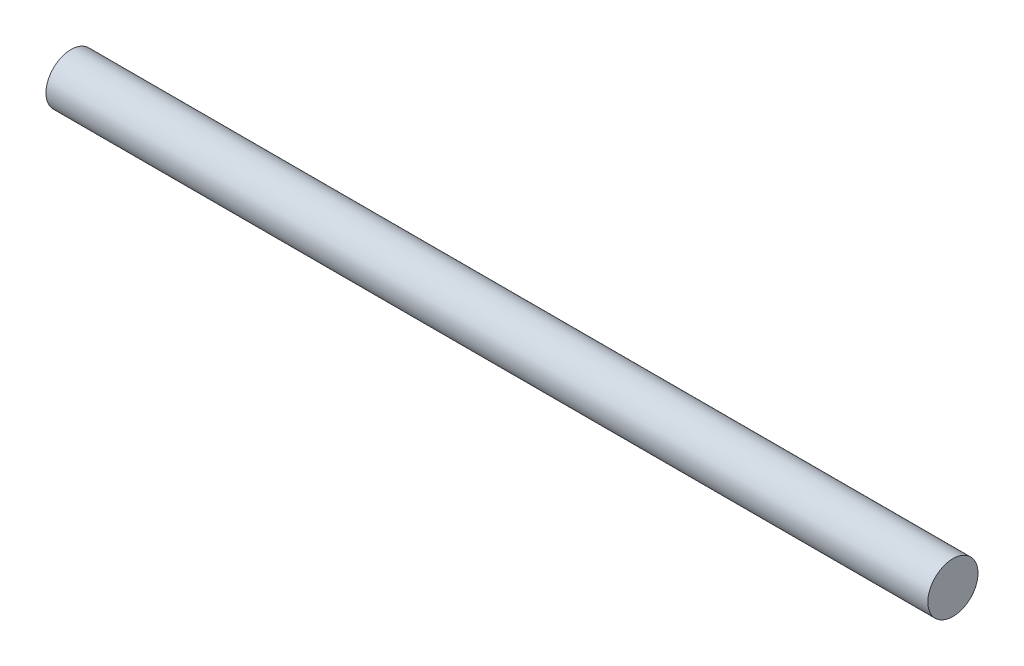
ISO-10303-21;
HEADER;
FILE_DESCRIPTION(('STEP AP214'),'2;1');
FILE_NAME('part.step','',(''),(''),'','','');
FILE_SCHEMA(('AUTOMOTIVE_DESIGN { 1 0 10303 214 1 1 1 1 }'));
ENDSEC;
DATA;
#1=APPLICATION_CONTEXT('core data for automotive mechanical design processes');
#2=APPLICATION_PROTOCOL_DEFINITION('international standard','automotive_design',2000,#1);
#3=PRODUCT_CONTEXT('',#1,'mechanical');
#4=PRODUCT('Part','Part','',(#3));
#5=PRODUCT_RELATED_PRODUCT_CATEGORY('part','',(#4));
#6=PRODUCT_DEFINITION_FORMATION('','',#4);
#7=PRODUCT_DEFINITION_CONTEXT('part definition',#1,'design');
#8=PRODUCT_DEFINITION('design','',#6,#7);
#9=PRODUCT_DEFINITION_SHAPE('','',#8);
#10=(LENGTH_UNIT() NAMED_UNIT(*) SI_UNIT(.MILLI.,.METRE.));
#11=(NAMED_UNIT(*) PLANE_ANGLE_UNIT() SI_UNIT($,.RADIAN.));
#12=(NAMED_UNIT(*) SI_UNIT($,.STERADIAN.) SOLID_ANGLE_UNIT());
#13=UNCERTAINTY_MEASURE_WITH_UNIT(LENGTH_MEASURE(1.E-05),#10,'distance_accuracy_value','');
#14=(GEOMETRIC_REPRESENTATION_CONTEXT(3) GLOBAL_UNCERTAINTY_ASSIGNED_CONTEXT((#13)) GLOBAL_UNIT_ASSIGNED_CONTEXT((#10,
#11,#12)) REPRESENTATION_CONTEXT('',''));
#15=CARTESIAN_POINT('',(0.,0.,0.));
#16=DIRECTION('',(0.,0.,1.));
#17=DIRECTION('',(1.,0.,0.));
#18=AXIS2_PLACEMENT_3D('',#15,#16,#17);
#19=CARTESIAN_POINT('',(87.9,0.,0.));
#20=DIRECTION('',(-1.,0.,0.));
#21=DIRECTION('',(0.,0.,1.));
#22=AXIS2_PLACEMENT_3D('',#19,#20,#21);
#23=CYLINDRICAL_SURFACE('',#22,2.5);
#24=CARTESIAN_POINT('',(87.9,0.,0.));
#25=DIRECTION('',(1.,0.,0.));
#26=DIRECTION('',(0.,0.,-1.));
#27=AXIS2_PLACEMENT_3D('',#24,#25,#26);
#28=CIRCLE('',#27,2.5);
#29=CARTESIAN_POINT('',(87.9,0.,-2.5));
#30=VERTEX_POINT('',#29);
#31=EDGE_CURVE('E10',#30,#30,#28,.T.);
#32=ORIENTED_EDGE('',*,*,#31,.F.);
#33=EDGE_LOOP('',(#32));
#34=FACE_BOUND('',#33,.T.);
#35=CARTESIAN_POINT('',(0.,0.,0.));
#36=DIRECTION('',(1.,0.,0.));
#37=DIRECTION('',(0.,0.,-1.));
#38=AXIS2_PLACEMENT_3D('',#35,#36,#37);
#39=CIRCLE('',#38,2.5);
#40=CARTESIAN_POINT('',(0.,0.,-2.5));
#41=VERTEX_POINT('',#40);
#42=EDGE_CURVE('E44',#41,#41,#39,.T.);
#43=ORIENTED_EDGE('',*,*,#42,.T.);
#44=EDGE_LOOP('',(#43));
#45=FACE_BOUND('',#44,.T.);
#46=ADVANCED_FACE('F41',(#34,#45),#23,.T.);
#47=CARTESIAN_POINT('',(87.9,0.,0.));
#48=DIRECTION('',(1.,0.,0.));
#49=DIRECTION('',(0.,0.,-1.));
#50=AXIS2_PLACEMENT_3D('',#47,#48,#49);
#51=PLANE('',#50);
#52=ORIENTED_EDGE('',*,*,#31,.T.);
#53=EDGE_LOOP('',(#52));
#54=FACE_BOUND('',#53,.T.);
#55=ADVANCED_FACE('F58',(#54),#51,.T.);
#56=CARTESIAN_POINT('',(0.,0.,0.));
#57=DIRECTION('',(1.,0.,0.));
#58=DIRECTION('',(0.,0.,-1.));
#59=AXIS2_PLACEMENT_3D('',#56,#57,#58);
#60=PLANE('',#59);
#61=ORIENTED_EDGE('',*,*,#42,.F.);
#62=EDGE_LOOP('',(#61));
#63=FACE_BOUND('',#62,.T.);
#64=ADVANCED_FACE('F56',(#63),#60,.F.);
#65=CLOSED_SHELL('',(#46,#55,#64));
#66=MANIFOLD_SOLID_BREP('B2',#65);
#67=ADVANCED_BREP_SHAPE_REPRESENTATION('',(#18,#66),#14);
#68=SHAPE_DEFINITION_REPRESENTATION(#9,#67);
ENDSEC;
END-ISO-10303-21;
